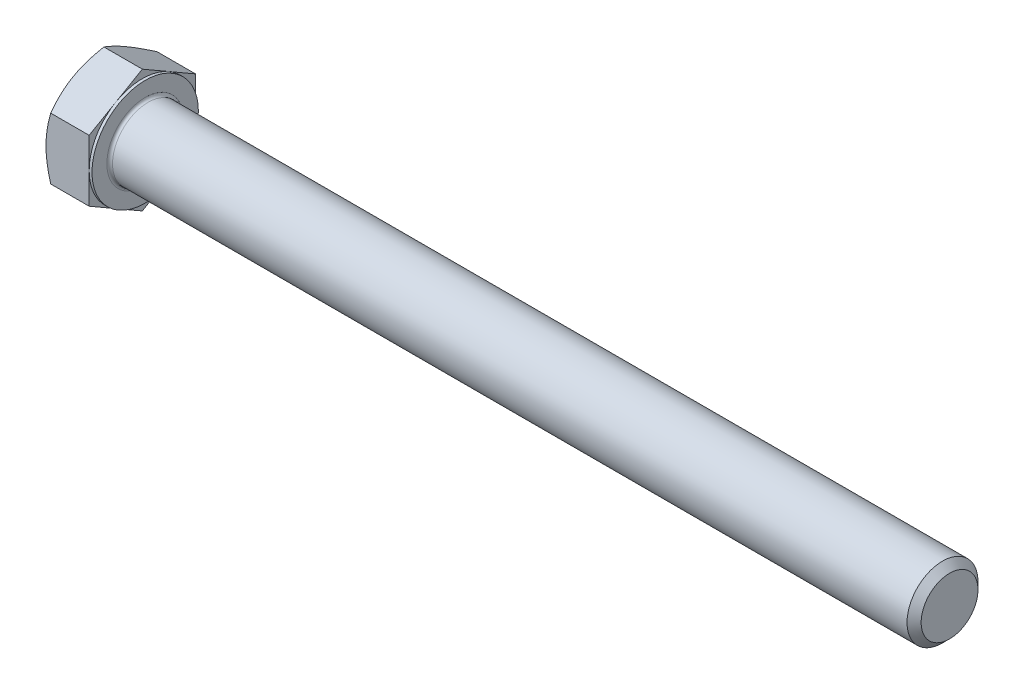
ISO-10303-21;
HEADER;
FILE_DESCRIPTION(('STEP AP214'),'2;1');
FILE_NAME('part.step','',(''),(''),'','','');
FILE_SCHEMA(('AUTOMOTIVE_DESIGN { 1 0 10303 214 1 1 1 1 }'));
ENDSEC;
DATA;
#1=APPLICATION_CONTEXT('core data for automotive mechanical design processes');
#2=APPLICATION_PROTOCOL_DEFINITION('international standard','automotive_design',2000,#1);
#3=PRODUCT_CONTEXT('',#1,'mechanical');
#4=PRODUCT('Part','Part','',(#3));
#5=PRODUCT_RELATED_PRODUCT_CATEGORY('part','',(#4));
#6=PRODUCT_DEFINITION_FORMATION('','',#4);
#7=PRODUCT_DEFINITION_CONTEXT('part definition',#1,'design');
#8=PRODUCT_DEFINITION('design','',#6,#7);
#9=PRODUCT_DEFINITION_SHAPE('','',#8);
#10=(LENGTH_UNIT() NAMED_UNIT(*) SI_UNIT(.MILLI.,.METRE.));
#11=(NAMED_UNIT(*) PLANE_ANGLE_UNIT() SI_UNIT($,.RADIAN.));
#12=(NAMED_UNIT(*) SI_UNIT($,.STERADIAN.) SOLID_ANGLE_UNIT());
#13=UNCERTAINTY_MEASURE_WITH_UNIT(LENGTH_MEASURE(1.E-05),#10,'distance_accuracy_value','');
#14=(GEOMETRIC_REPRESENTATION_CONTEXT(3) GLOBAL_UNCERTAINTY_ASSIGNED_CONTEXT((#13)) GLOBAL_UNIT_ASSIGNED_CONTEXT((#10,
#11,#12)) REPRESENTATION_CONTEXT('',''));
#15=CARTESIAN_POINT('',(0.,0.,0.));
#16=DIRECTION('',(0.,0.,1.));
#17=DIRECTION('',(1.,0.,0.));
#18=AXIS2_PLACEMENT_3D('',#15,#16,#17);
#19=CARTESIAN_POINT('',(6.1722,8.24155962262808,0.));
#20=DIRECTION('',(1.,0.,0.));
#21=DIRECTION('',(0.,0.,-1.));
#22=AXIS2_PLACEMENT_3D('',#19,#20,#21);
#23=PLANE('',#22);
#24=CARTESIAN_POINT('',(6.1722,0.,0.));
#25=DIRECTION('',(1.,0.,0.));
#26=DIRECTION('',(0.,0.,-1.));
#27=AXIS2_PLACEMENT_3D('',#24,#25,#26);
#28=CIRCLE('',#27,5.1435);
#29=CARTESIAN_POINT('',(6.1722,0.,-5.1435));
#30=VERTEX_POINT('',#29);
#31=EDGE_CURVE('E49',#30,#30,#28,.F.);
#32=ORIENTED_EDGE('',*,*,#31,.T.);
#33=EDGE_LOOP('',(#32));
#34=FACE_BOUND('',#33,.T.);
#35=CARTESIAN_POINT('',(6.1722,0.,0.));
#36=DIRECTION('',(1.,0.,0.));
#37=DIRECTION('',(0.,0.,-1.));
#38=AXIS2_PLACEMENT_3D('',#35,#36,#37);
#39=CIRCLE('',#38,7.1374);
#40=CARTESIAN_POINT('',(6.1722,0.,-7.1374));
#41=VERTEX_POINT('',#40);
#42=EDGE_CURVE('E306',#41,#41,#39,.T.);
#43=ORIENTED_EDGE('',*,*,#42,.T.);
#44=EDGE_LOOP('',(#43));
#45=FACE_BOUND('',#44,.T.);
#46=ADVANCED_FACE('F41',(#34,#45),#23,.T.);
#47=CARTESIAN_POINT('',(0.,0.,0.));
#48=DIRECTION('',(-1.,0.,0.));
#49=DIRECTION('',(0.,0.,1.));
#50=AXIS2_PLACEMENT_3D('',#47,#48,#49);
#51=CYLINDRICAL_SURFACE('',#50,4.7625);
#52=CARTESIAN_POINT('',(6.5532,0.,0.));
#53=DIRECTION('',(1.,0.,0.));
#54=DIRECTION('',(0.,0.,-1.));
#55=AXIS2_PLACEMENT_3D('',#52,#53,#54);
#56=CIRCLE('',#55,4.7625);
#57=CARTESIAN_POINT('',(6.5532,0.,-4.7625));
#58=VERTEX_POINT('',#57);
#59=EDGE_CURVE('E11',#58,#58,#56,.T.);
#60=ORIENTED_EDGE('',*,*,#59,.T.);
#61=EDGE_LOOP('',(#60));
#62=FACE_BOUND('',#61,.T.);
#63=CARTESIAN_POINT('',(113.17605,0.,0.));
#64=DIRECTION('',(-1.,0.,0.));
#65=DIRECTION('',(0.,0.,1.));
#66=AXIS2_PLACEMENT_3D('',#63,#64,#65);
#67=CIRCLE('',#66,4.7625);
#68=CARTESIAN_POINT('',(113.17605,0.,4.7625));
#69=VERTEX_POINT('',#68);
#70=EDGE_CURVE('E285',#69,#69,#67,.T.);
#71=ORIENTED_EDGE('',*,*,#70,.T.);
#72=EDGE_LOOP('',(#71));
#73=FACE_BOUND('',#72,.T.);
#74=ADVANCED_FACE('F259',(#62,#73),#51,.T.);
#75=CARTESIAN_POINT('',(114.1222,0.,0.));
#76=DIRECTION('',(-1.,0.,0.));
#77=DIRECTION('',(0.,0.,1.));
#78=AXIS2_PLACEMENT_3D('',#75,#76,#77);
#79=CONICAL_SURFACE('',#78,3.81635,0.785398163397437);
#80=ORIENTED_EDGE('',*,*,#70,.F.);
#81=EDGE_LOOP('',(#80));
#82=FACE_BOUND('',#81,.T.);
#83=CARTESIAN_POINT('',(114.1222,0.,0.));
#84=DIRECTION('',(-1.,0.,0.));
#85=DIRECTION('',(0.,0.,1.));
#86=AXIS2_PLACEMENT_3D('',#83,#84,#85);
#87=CIRCLE('',#86,3.81635);
#88=CARTESIAN_POINT('',(114.1222,0.,3.81635));
#89=VERTEX_POINT('',#88);
#90=EDGE_CURVE('E283',#89,#89,#87,.T.);
#91=ORIENTED_EDGE('',*,*,#90,.T.);
#92=EDGE_LOOP('',(#91));
#93=FACE_BOUND('',#92,.T.);
#94=ADVANCED_FACE('F264',(#82,#93),#79,.T.);
#95=CARTESIAN_POINT('',(114.1222,0.,0.));
#96=DIRECTION('',(-1.,0.,0.));
#97=DIRECTION('',(0.,0.,1.));
#98=AXIS2_PLACEMENT_3D('',#95,#96,#97);
#99=PLANE('',#98);
#100=ORIENTED_EDGE('',*,*,#90,.F.);
#101=EDGE_LOOP('',(#100));
#102=FACE_BOUND('',#101,.T.);
#103=ADVANCED_FACE('F271',(#102),#99,.F.);
#104=CARTESIAN_POINT('',(5.7912,7.1374,0.));
#105=DIRECTION('',(1.,0.,0.));
#106=DIRECTION('',(0.,0.,-1.));
#107=AXIS2_PLACEMENT_3D('',#104,#105,#106);
#108=PLANE('',#107);
#109=DIRECTION('',(0.,0.500000000000001,0.866025403784438));
#110=VECTOR('',#109,1.);
#111=CARTESIAN_POINT('',(5.7912,4.12077981131404,-7.1374));
#112=LINE('',#111,#110);
#113=CARTESIAN_POINT('',(5.7912,4.12077981131404,-7.1374));
#114=VERTEX_POINT('',#113);
#115=CARTESIAN_POINT('',(5.7912,6.18116971697105,-3.56870000000001));
#116=VERTEX_POINT('',#115);
#117=EDGE_CURVE('E173',#114,#116,#112,.T.);
#118=ORIENTED_EDGE('',*,*,#117,.T.);
#119=CARTESIAN_POINT('',(5.7912,0.,0.));
#120=DIRECTION('',(-1.,0.,0.));
#121=DIRECTION('',(0.,0.,1.));
#122=AXIS2_PLACEMENT_3D('',#119,#120,#121);
#123=CIRCLE('',#122,7.1374);
#124=CARTESIAN_POINT('',(5.7912,0.,-7.1374));
#125=VERTEX_POINT('',#124);
#126=EDGE_CURVE('E56',#116,#125,#123,.T.);
#127=ORIENTED_EDGE('',*,*,#126,.T.);
#128=DIRECTION('',(0.,1.,0.));
#129=VECTOR('',#128,1.);
#130=CARTESIAN_POINT('',(5.7912,4.12077981131404,-7.1374));
#131=LINE('',#130,#129);
#132=EDGE_CURVE('E309',#125,#114,#131,.T.);
#133=ORIENTED_EDGE('',*,*,#132,.T.);
#134=EDGE_LOOP('',(#118,#127,#133));
#135=FACE_BOUND('',#134,.T.);
#136=ADVANCED_FACE('F274',(#135),#108,.T.);
#137=CARTESIAN_POINT('',(5.7912,8.24155962262808,0.));
#138=VERTEX_POINT('',#137);
#139=EDGE_CURVE('E171',#116,#138,#112,.T.);
#140=ORIENTED_EDGE('',*,*,#139,.T.);
#141=DIRECTION('',(0.,-0.500000000000001,0.866025403784438));
#142=VECTOR('',#141,1.);
#143=CARTESIAN_POINT('',(5.7912,8.24155962262808,0.));
#144=LINE('',#143,#142);
#145=CARTESIAN_POINT('',(5.7912,6.18116971697105,3.56870000000001));
#146=VERTEX_POINT('',#145);
#147=EDGE_CURVE('E170',#138,#146,#144,.T.);
#148=ORIENTED_EDGE('',*,*,#147,.T.);
#149=EDGE_CURVE('E159',#146,#116,#123,.T.);
#150=ORIENTED_EDGE('',*,*,#149,.T.);
#151=EDGE_LOOP('',(#140,#148,#150));
#152=FACE_BOUND('',#151,.T.);
#153=ADVANCED_FACE('F279',(#152),#108,.T.);
#154=CARTESIAN_POINT('',(5.7912,4.12077981131403,7.1374));
#155=VERTEX_POINT('',#154);
#156=EDGE_CURVE('E138',#146,#155,#144,.T.);
#157=ORIENTED_EDGE('',*,*,#156,.T.);
#158=DIRECTION('',(0.,-1.,0.));
#159=VECTOR('',#158,1.);
#160=CARTESIAN_POINT('',(5.7912,4.12077981131403,7.1374));
#161=LINE('',#160,#159);
#162=CARTESIAN_POINT('',(5.7912,0.,7.1374));
#163=VERTEX_POINT('',#162);
#164=EDGE_CURVE('E132',#155,#163,#161,.T.);
#165=ORIENTED_EDGE('',*,*,#164,.T.);
#166=EDGE_CURVE('E136',#163,#146,#123,.T.);
#167=ORIENTED_EDGE('',*,*,#166,.T.);
#168=EDGE_LOOP('',(#157,#165,#167));
#169=FACE_BOUND('',#168,.T.);
#170=ADVANCED_FACE('F134',(#169),#108,.T.);
#171=CARTESIAN_POINT('',(5.7912,-4.12077981131405,7.1374));
#172=VERTEX_POINT('',#171);
#173=EDGE_CURVE('E142',#163,#172,#161,.T.);
#174=ORIENTED_EDGE('',*,*,#173,.T.);
#175=DIRECTION('',(0.,-0.500000000000001,-0.866025403784438));
#176=VECTOR('',#175,1.);
#177=CARTESIAN_POINT('',(5.7912,-8.2415596226281,0.));
#178=LINE('',#177,#176);
#179=CARTESIAN_POINT('',(5.7912,-6.18116971697105,3.5687));
#180=VERTEX_POINT('',#179);
#181=EDGE_CURVE('E149',#172,#180,#178,.T.);
#182=ORIENTED_EDGE('',*,*,#181,.T.);
#183=EDGE_CURVE('E146',#180,#163,#123,.T.);
#184=ORIENTED_EDGE('',*,*,#183,.T.);
#185=EDGE_LOOP('',(#174,#182,#184));
#186=FACE_BOUND('',#185,.T.);
#187=ADVANCED_FACE('F147',(#186),#108,.T.);
#188=CARTESIAN_POINT('',(5.7912,-8.2415596226281,0.));
#189=VERTEX_POINT('',#188);
#190=EDGE_CURVE('E165',#180,#189,#178,.T.);
#191=ORIENTED_EDGE('',*,*,#190,.T.);
#192=DIRECTION('',(0.,0.500000000000001,-0.866025403784438));
#193=VECTOR('',#192,1.);
#194=CARTESIAN_POINT('',(5.7912,-4.12077981131404,-7.1374));
#195=LINE('',#194,#193);
#196=CARTESIAN_POINT('',(5.7912,-6.18116971697105,-3.56870000000001));
#197=VERTEX_POINT('',#196);
#198=EDGE_CURVE('E347',#189,#197,#195,.T.);
#199=ORIENTED_EDGE('',*,*,#198,.T.);
#200=EDGE_CURVE('E153',#197,#180,#123,.T.);
#201=ORIENTED_EDGE('',*,*,#200,.T.);
#202=EDGE_LOOP('',(#191,#199,#201));
#203=FACE_BOUND('',#202,.T.);
#204=ADVANCED_FACE('F348',(#203),#108,.T.);
#205=CARTESIAN_POINT('',(5.7912,-4.12077981131404,-7.1374));
#206=VERTEX_POINT('',#205);
#207=EDGE_CURVE('E160',#197,#206,#195,.T.);
#208=ORIENTED_EDGE('',*,*,#207,.T.);
#209=EDGE_CURVE('E310',#206,#125,#131,.T.);
#210=ORIENTED_EDGE('',*,*,#209,.T.);
#211=EDGE_CURVE('E317',#125,#197,#123,.T.);
#212=ORIENTED_EDGE('',*,*,#211,.T.);
#213=EDGE_LOOP('',(#208,#210,#212));
#214=FACE_BOUND('',#213,.T.);
#215=ADVANCED_FACE('F280',(#214),#108,.T.);
#216=CARTESIAN_POINT('',(0.,0.,0.));
#217=DIRECTION('',(-1.,0.,0.));
#218=DIRECTION('',(0.,0.,1.));
#219=AXIS2_PLACEMENT_3D('',#216,#217,#218);
#220=CYLINDRICAL_SURFACE('',#219,7.1374);
#221=ORIENTED_EDGE('',*,*,#126,.F.);
#222=ORIENTED_EDGE('',*,*,#149,.F.);
#223=ORIENTED_EDGE('',*,*,#166,.F.);
#224=ORIENTED_EDGE('',*,*,#183,.F.);
#225=ORIENTED_EDGE('',*,*,#200,.F.);
#226=ORIENTED_EDGE('',*,*,#211,.F.);
#227=EDGE_LOOP('',(#221,#222,#223,#224,#225,#226));
#228=FACE_BOUND('',#227,.T.);
#229=ORIENTED_EDGE('',*,*,#42,.F.);
#230=EDGE_LOOP('',(#229));
#231=FACE_BOUND('',#230,.T.);
#232=ADVANCED_FACE('F156',(#228,#231),#220,.T.);
#233=CARTESIAN_POINT('',(0.,8.24155962262808,0.));
#234=DIRECTION('',(1.,0.,0.));
#235=DIRECTION('',(0.,0.,-1.));
#236=AXIS2_PLACEMENT_3D('',#233,#234,#235);
#237=PLANE('',#236);
#238=CARTESIAN_POINT('',(0.,0.,0.));
#239=DIRECTION('',(1.,0.,0.));
#240=DIRECTION('',(0.,0.,-1.));
#241=AXIS2_PLACEMENT_3D('',#238,#239,#240);
#242=CIRCLE('',#241,7.1374);
#243=CARTESIAN_POINT('',(0.,0.,-7.1374));
#244=VERTEX_POINT('',#243);
#245=CARTESIAN_POINT('',(0.,6.18116971697105,-3.56870000000001));
#246=VERTEX_POINT('',#245);
#247=EDGE_CURVE('E305',#244,#246,#242,.T.);
#248=ORIENTED_EDGE('',*,*,#247,.F.);
#249=CARTESIAN_POINT('',(0.,-6.18116971697105,-3.56870000000001));
#250=VERTEX_POINT('',#249);
#251=EDGE_CURVE('E301',#250,#244,#242,.T.);
#252=ORIENTED_EDGE('',*,*,#251,.F.);
#253=CARTESIAN_POINT('',(0.,-6.18116971697105,3.5687));
#254=VERTEX_POINT('',#253);
#255=EDGE_CURVE('E304',#254,#250,#242,.T.);
#256=ORIENTED_EDGE('',*,*,#255,.F.);
#257=CARTESIAN_POINT('',(0.,0.,7.1374));
#258=VERTEX_POINT('',#257);
#259=EDGE_CURVE('E340',#258,#254,#242,.T.);
#260=ORIENTED_EDGE('',*,*,#259,.F.);
#261=CARTESIAN_POINT('',(0.,0.,0.));
#262=DIRECTION('',(-1.,0.,0.));
#263=DIRECTION('',(0.,0.,1.));
#264=AXIS2_PLACEMENT_3D('',#261,#262,#263);
#265=CIRCLE('',#264,7.1374);
#266=CARTESIAN_POINT('',(0.,6.18116971697105,3.56870000000001));
#267=VERTEX_POINT('',#266);
#268=EDGE_CURVE('E174',#258,#267,#265,.T.);
#269=ORIENTED_EDGE('',*,*,#268,.T.);
#270=EDGE_CURVE('E363',#246,#267,#242,.T.);
#271=ORIENTED_EDGE('',*,*,#270,.F.);
#272=EDGE_LOOP('',(#248,#252,#256,#260,#269,#271));
#273=FACE_BOUND('',#272,.T.);
#274=ADVANCED_FACE('F205',(#273),#237,.F.);
#275=CARTESIAN_POINT('',(0.,0.,0.));
#276=DIRECTION('',(1.,0.,0.));
#277=DIRECTION('',(0.,0.,-1.));
#278=AXIS2_PLACEMENT_3D('',#275,#276,#277);
#279=CONICAL_SURFACE('',#278,7.1374,1.0471975511966);
#280=CARTESIAN_POINT('',(0.637553523420339,4.12066434126019,7.1376));
#281=CARTESIAN_POINT('',(0.58526538956535,4.21124371496189,6.98071192263089));
#282=CARTESIAN_POINT('',(0.535350289912878,4.30216081235838,6.82323889066349));
#283=CARTESIAN_POINT('',(0.440919739394803,4.48473335117252,6.50701397737055));
#284=CARTESIAN_POINT('',(0.396406617864097,4.57638909305606,6.34826157562284));
#285=CARTESIAN_POINT('',(0.271843946604595,4.85282383651272,5.86946255497863));
#286=CARTESIAN_POINT('',(0.200994122533559,5.03869401839218,5.54752595635136));
#287=CARTESIAN_POINT('',(0.117914357261565,5.31684536279813,5.06575369564665));
#288=CARTESIAN_POINT('',(0.0942473375753666,5.40829544262839,4.90735751102442));
#289=CARTESIAN_POINT('',(0.0545611977075643,5.59160881473483,4.58984943682929));
#290=CARTESIAN_POINT('',(0.038541401796634,5.68347206977738,4.43073761174693));
#291=CARTESIAN_POINT('',(0.014557978666983,5.86735812462442,4.11223762194846));
#292=CARTESIAN_POINT('',(0.00658520869042971,5.95938062410295,3.95284997741216));
#293=CARTESIAN_POINT('',(-0.00114175893561372,6.14350554574354,3.63393625819102));
#294=CARTESIAN_POINT('',(-0.00089621048245938,6.23560796534863,3.47441018793498));
#295=CARTESIAN_POINT('',(0.0110730517201795,6.48793781485856,3.03736206831758));
#296=CARTESIAN_POINT('',(0.0311658852990948,6.64808264372754,2.75998308814708));
#297=CARTESIAN_POINT('',(0.0948800883359096,6.96730863431005,2.20706745336167));
#298=CARTESIAN_POINT('',(0.138523234308963,7.12638867338148,1.93153274321992));
#299=CARTESIAN_POINT('',(0.247618299095078,7.44625708984547,1.3775043941677));
#300=CARTESIAN_POINT('',(0.313532435992714,7.60700510648809,1.09908066212675));
#301=CARTESIAN_POINT('',(0.463130880450467,7.926103951898,0.546385249240217));
#302=CARTESIAN_POINT('',(0.546780048637376,8.08445886717215,0.272106490357123));
#303=CARTESIAN_POINT('',(0.637553523420346,8.24167509268192,-0.000200000000000164));
#304=B_SPLINE_CURVE_WITH_KNOTS('',3,(#280,#281,#282,#283,#284,#285,#286,#287,#288,#289,#290,
#291,#292,#293,#294,#295,#296,#297,#298,#299,#300,#301,#302,#303),.UNSPECIFIED.,.F.,.F.,(4,2,2,
2,2,2,2,2,2,2,2,4),(0.,0.565616271543686,1.13147557690344,2.26554547664276,2.81869146049268,
3.37178855781927,3.92425653519419,4.4767074445971,5.4384561482934,6.40109569003607,
7.3850851165131,8.36714283329691),.UNSPECIFIED.);
#305=CARTESIAN_POINT('',(0.637486855352628,8.24155962262808,0.));
#306=VERTEX_POINT('',#305);
#307=EDGE_CURVE('E225',#267,#306,#304,.T.);
#308=ORIENTED_EDGE('',*,*,#307,.T.);
#309=CARTESIAN_POINT('',(0.637553523420345,8.24167509268192,0.000200000000000209));
#310=CARTESIAN_POINT('',(0.585265389565357,8.15109571898022,-0.15668807736911));
#311=CARTESIAN_POINT('',(0.535350289912885,8.06017862158373,-0.314161109336511));
#312=CARTESIAN_POINT('',(0.44091973939481,7.87760608276959,-0.63038602262945));
#313=CARTESIAN_POINT('',(0.396406617864103,7.78595034088605,-0.789138424377165));
#314=CARTESIAN_POINT('',(0.2718439466046,7.50951559742939,-1.26793744502137));
#315=CARTESIAN_POINT('',(0.200994122533562,7.32364541554993,-1.58987404364865));
#316=CARTESIAN_POINT('',(0.117914357261569,7.04549407114397,-2.07164630435335));
#317=CARTESIAN_POINT('',(0.0942473375753701,6.95404399131372,-2.23004248897558));
#318=CARTESIAN_POINT('',(0.0545611977075678,6.77073061920728,-2.54755056317072));
#319=CARTESIAN_POINT('',(0.0385414017966372,6.67886736416473,-2.70666238825308));
#320=CARTESIAN_POINT('',(0.0145579786669858,6.49498130931769,-3.02516237805154));
#321=CARTESIAN_POINT('',(0.00658520869043239,6.40295880983916,-3.18455002258784));
#322=CARTESIAN_POINT('',(-0.00114175893561164,6.21883388819857,-3.50346374180898));
#323=CARTESIAN_POINT('',(-0.000896210482457776,6.12673146859347,-3.66298981206503));
#324=CARTESIAN_POINT('',(0.0110730517201801,5.87440161908355,-4.10003793168242));
#325=CARTESIAN_POINT('',(0.031165885299095,5.71425679021457,-4.37741691185292));
#326=CARTESIAN_POINT('',(0.0948800883359092,5.39503079963206,-4.93033254663833));
#327=CARTESIAN_POINT('',(0.138523234308962,5.23595076056063,-5.20586725678008));
#328=CARTESIAN_POINT('',(0.247618299095076,4.91608234409665,-5.75989560583231));
#329=CARTESIAN_POINT('',(0.313532435992711,4.75533432745403,-6.03831933787326));
#330=CARTESIAN_POINT('',(0.463130880450462,4.43623548204412,-6.59101475075978));
#331=CARTESIAN_POINT('',(0.54678004863737,4.27788056676997,-6.86529350964288));
#332=CARTESIAN_POINT('',(0.63755352342034,4.1206643412602,-7.1376));
#333=B_SPLINE_CURVE_WITH_KNOTS('',3,(#309,#310,#311,#312,#313,#314,#315,#316,#317,#318,#319,
#320,#321,#322,#323,#324,#325,#326,#327,#328,#329,#330,#331,#332),.UNSPECIFIED.,.F.,.F.,(4,2,2,
2,2,2,2,2,2,2,2,4),(0.,0.565616271543686,1.13147557690344,2.26554547664276,2.81869146049269,
3.37178855781927,3.9242565351942,4.4767074445971,5.43845614829341,6.40109569003607,
7.3850851165131,8.36714283329691),.UNSPECIFIED.);
#334=EDGE_CURVE('E64',#306,#246,#333,.T.);
#335=ORIENTED_EDGE('',*,*,#334,.T.);
#336=ORIENTED_EDGE('',*,*,#270,.T.);
#337=EDGE_LOOP('',(#308,#335,#336));
#338=FACE_BOUND('',#337,.T.);
#339=ADVANCED_FACE('F364',(#338),#279,.T.);
#340=CARTESIAN_POINT('',(3.51793891464085,-11.1403587268438,7.1374));
#341=CARTESIAN_POINT('',(3.3661176136154,-10.8279722926894,7.1374));
#342=CARTESIAN_POINT('',(3.21573167435815,-10.5148763007017,7.1374));
#343=CARTESIAN_POINT('',(2.91863653133451,-9.88688803265222,7.1374));
#344=CARTESIAN_POINT('',(2.77192789362363,-9.57199548909057,7.1374));
#345=CARTESIAN_POINT('',(2.4822707439764,-8.93844907707205,7.1374));
#346=CARTESIAN_POINT('',(2.33934643030354,-8.61978410734443,7.1374));
#347=CARTESIAN_POINT('',(2.05925336317274,-7.97994405772781,7.1374));
#348=CARTESIAN_POINT('',(1.92208434228597,-7.65876909529411,7.1374));
#349=CARTESIAN_POINT('',(1.65065378230837,-7.00284865103087,7.1374));
#350=CARTESIAN_POINT('',(1.51663374065787,-6.66800268560586,7.1374));
#351=CARTESIAN_POINT('',(1.25856485288051,-5.99442084818067,7.1374));
#352=CARTESIAN_POINT('',(1.13451711533335,-5.65568454847852,7.1374));
#353=CARTESIAN_POINT('',(0.899596727677593,-4.97438980758157,7.1374));
#354=CARTESIAN_POINT('',(0.788698036742921,-4.6318404419915,7.1374));
#355=CARTESIAN_POINT('',(0.583585288609217,-3.94184101121263,7.1374));
#356=CARTESIAN_POINT('',(0.489366053461918,-3.59439250319722,7.1374));
#357=CARTESIAN_POINT('',(0.322585119775292,-2.8962364341233,7.1374));
#358=CARTESIAN_POINT('',(0.249906108267925,-2.5455576685563,7.1374));
#359=CARTESIAN_POINT('',(0.160162927876229,-2.01629019056177,7.1374));
#360=CARTESIAN_POINT('',(0.133459926561138,-1.8393139589974,7.1374));
#361=CARTESIAN_POINT('',(0.0870009608751889,-1.48445773938037,7.1374));
#362=CARTESIAN_POINT('',(0.0672443235865599,-1.30657784056352,7.1374));
#363=CARTESIAN_POINT('',(0.0353233928817926,-0.952509042934691,7.1374));
#364=CARTESIAN_POINT('',(0.0230620606560385,-0.776328928434261,7.1374));
#365=CARTESIAN_POINT('',(0.00600431660240971,-0.42360784078969,7.1374));
#366=CARTESIAN_POINT('',(0.00120777872271334,-0.247066873789374,7.1374));
#367=CARTESIAN_POINT('',(-0.000805707966080239,0.106061109313523,7.1374));
#368=CARTESIAN_POINT('',(0.00197740745485942,0.282648125793647,7.1374));
#369=CARTESIAN_POINT('',(0.0150543642253246,0.635545980126688,7.1374));
#370=CARTESIAN_POINT('',(0.0253485677088149,0.81185680425272,7.1374));
#371=CARTESIAN_POINT('',(0.058717354667661,1.23335791869124,7.1374));
#372=CARTESIAN_POINT('',(0.0852317102922975,1.47828183508493,7.1374));
#373=CARTESIAN_POINT('',(0.151325348901077,1.96634766484073,7.1374));
#374=CARTESIAN_POINT('',(0.190906342916655,2.20948934055999,7.1374));
#375=CARTESIAN_POINT('',(0.327153349211705,2.93593608611635,7.1374));
#376=CARTESIAN_POINT('',(0.44130049501773,3.41600789467397,7.1374));
#377=CARTESIAN_POINT('',(0.639740105584511,4.13409780337112,7.1374));
#378=CARTESIAN_POINT('',(0.711386839279739,4.37582477933244,7.1374));
#379=CARTESIAN_POINT('',(0.862240726867137,4.8569312345941,7.1374));
#380=CARTESIAN_POINT('',(0.941447936163005,5.09631069667751,7.1374));
#381=CARTESIAN_POINT('',(1.10614180608764,5.57279746249286,7.1374));
#382=CARTESIAN_POINT('',(1.19162653724197,5.80990543927402,7.1374));
#383=CARTESIAN_POINT('',(1.36785754588297,6.2821465109029,7.1374));
#384=CARTESIAN_POINT('',(1.4586037216663,6.51727964382368,7.1374));
#385=CARTESIAN_POINT('',(1.70099135878086,7.12822933634875,7.1374));
#386=CARTESIAN_POINT('',(1.85611245200932,7.50266378649051,7.1374));
#387=CARTESIAN_POINT('',(2.17492034788947,8.24788094227115,7.1374));
#388=CARTESIAN_POINT('',(2.338607954525,8.61866330126001,7.1374));
#389=CARTESIAN_POINT('',(2.67260301704526,9.35737269718078,7.1374));
#390=CARTESIAN_POINT('',(2.84291264405929,9.72529874938112,7.1374));
#391=CARTESIAN_POINT('',(3.18863367809307,10.4587232704182,7.1374));
#392=CARTESIAN_POINT('',(3.36404491157501,10.8242218213112,7.1374));
#393=CARTESIAN_POINT('',(3.71915496627049,11.553777334436,7.1374));
#394=CARTESIAN_POINT('',(3.89885959822866,11.9178314626509,7.1374));
#395=CARTESIAN_POINT('',(4.26150568432076,12.6443245246618,7.1374));
#396=CARTESIAN_POINT('',(4.44444716083242,13.0067634472695,7.1374));
#397=CARTESIAN_POINT('',(4.81291716764715,13.7302353242129,7.1374));
#398=CARTESIAN_POINT('',(4.99844519827983,14.0912685333269,7.1374));
#399=CARTESIAN_POINT('',(5.37165471040536,14.8122208146436,7.1374));
#400=CARTESIAN_POINT('',(5.5593362003751,15.1721398824537,7.1374));
#401=CARTESIAN_POINT('',(6.08751400276288,16.178957952041,7.1374));
#402=CARTESIAN_POINT('',(6.43000254365912,16.8248116492746,7.1374));
#403=CARTESIAN_POINT('',(7.11919785487995,18.1143032770824,7.1374));
#404=CARTESIAN_POINT('',(7.46590484738284,18.7579410886394,7.1374));
#405=CARTESIAN_POINT('',(8.16140637459828,20.0415314633599,7.1374));
#406=CARTESIAN_POINT('',(8.51019123426671,20.6814892741017,7.1374));
#407=CARTESIAN_POINT('',(9.21019417047442,21.9600146152105,7.1374));
#408=CARTESIAN_POINT('',(9.56141207357467,22.5985822404971,7.1374));
#409=CARTESIAN_POINT('',(9.91351913441366,23.2366555668877,7.1374));
#410=B_SPLINE_CURVE_WITH_KNOTS('',3,(#340,#341,#342,#343,#344,#345,#346,#347,#348,#349,#350,
#351,#352,#353,#354,#355,#356,#357,#358,#359,#360,#361,#362,#363,#364,#365,#366,#367,#368,#369,
#370,#371,#372,#373,#374,#375,#376,#377,#378,#379,#380,#381,#382,#383,#384,#385,#386,#387,#388,
#389,#390,#391,#392,#393,#394,#395,#396,#397,#398,#399,#400,#401,#402,#403,#404,#405,#406,#407,
#408,#409),.UNSPECIFIED.,.F.,.F.,(4,2,2,2,2,2,2,2,2,2,2,2,2,2,2,2,2,2,2,2,2,2,2,2,2,2,2,2,2,2,2,
2,2,2,4),(0.,1.0419888362068,2.08413709519682,3.13183784368231,4.17948985504911,
5.26137797247103,6.34338619307611,7.42321444996099,8.50270689628368,9.57620733057732,
10.113030795566,10.6498022423129,11.179468394122,11.7091256017988,12.2387872978086,
12.7684745322176,13.507123574382,14.245869378494,15.7241255438818,16.4804246089875,
17.2367292167316,17.9928023300467,18.7488608333938,19.9645892594812,21.1804319893616,
22.3966767697583,23.6128802262777,24.8308351286453,26.0487984545625,27.2665296678531,
28.4842656762732,30.6773737382256,32.8705978115956,35.0570894097065,37.2434267159856),.UNSPECIFIED.);
#411=CARTESIAN_POINT('',(0.637486855352622,4.12077981131403,7.1374));
#412=VERTEX_POINT('',#411);
#413=EDGE_CURVE('E239',#258,#412,#410,.T.);
#414=ORIENTED_EDGE('',*,*,#413,.T.);
#415=EDGE_CURVE('E238',#412,#267,#304,.T.);
#416=ORIENTED_EDGE('',*,*,#415,.T.);
#417=ORIENTED_EDGE('',*,*,#268,.F.);
#418=EDGE_LOOP('',(#414,#416,#417));
#419=FACE_BOUND('',#418,.T.);
#420=ADVANCED_FACE('F334',(#419),#279,.T.);
#421=CARTESIAN_POINT('',(0.637486855352629,-4.12077981131405,7.1374));
#422=VERTEX_POINT('',#421);
#423=EDGE_CURVE('E286',#422,#258,#410,.T.);
#424=ORIENTED_EDGE('',*,*,#423,.T.);
#425=ORIENTED_EDGE('',*,*,#259,.T.);
#426=CARTESIAN_POINT('',(0.637553523420355,-8.24167509268193,-0.000200000000000293));
#427=CARTESIAN_POINT('',(0.585265389565366,-8.15109571898024,0.15668807736911));
#428=CARTESIAN_POINT('',(0.535350289912893,-8.06017862158375,0.314161109336512));
#429=CARTESIAN_POINT('',(0.440919739394818,-7.8776060827696,0.630386022629452));
#430=CARTESIAN_POINT('',(0.396406617864111,-7.78595034088606,0.789138424377167));
#431=CARTESIAN_POINT('',(0.271843946604609,-7.5095155974294,1.26793744502137));
#432=CARTESIAN_POINT('',(0.200994122533572,-7.32364541554995,1.58987404364865));
#433=CARTESIAN_POINT('',(0.117914357261578,-7.04549407114399,2.07164630435336));
#434=CARTESIAN_POINT('',(0.0942473375753785,-6.95404399131374,2.23004248897559));
#435=CARTESIAN_POINT('',(0.0545611977075756,-6.77073061920729,2.54755056317072));
#436=CARTESIAN_POINT('',(0.0385414017966451,-6.67886736416474,2.70666238825308));
#437=CARTESIAN_POINT('',(0.0145579786669937,-6.4949813093177,3.02516237805155));
#438=CARTESIAN_POINT('',(0.00658520869044016,-6.40295880983917,3.18455002258785));
#439=CARTESIAN_POINT('',(-0.00114175893560389,-6.21883388819858,3.50346374180899));
#440=CARTESIAN_POINT('',(-0.000896210482449921,-6.12673146859349,3.66298981206504));
#441=CARTESIAN_POINT('',(0.0110730517201883,-5.87440161908356,4.10003793168243));
#442=CARTESIAN_POINT('',(0.0311658852991035,-5.71425679021458,4.37741691185293));
#443=CARTESIAN_POINT('',(0.0948800883359176,-5.39503079963207,4.93033254663834));
#444=CARTESIAN_POINT('',(0.13852323430897,-5.23595076056065,5.20586725678009));
#445=CARTESIAN_POINT('',(0.247618299095084,-4.91608234409666,5.75989560583231));
#446=CARTESIAN_POINT('',(0.313532435992718,-4.75533432745404,6.03831933787326));
#447=CARTESIAN_POINT('',(0.463130880450469,-4.43623548204413,6.59101475075979));
#448=CARTESIAN_POINT('',(0.546780048637376,-4.27788056676998,6.86529350964288));
#449=CARTESIAN_POINT('',(0.637553523420346,-4.12066434126022,7.1376));
#450=B_SPLINE_CURVE_WITH_KNOTS('',3,(#426,#427,#428,#429,#430,#431,#432,#433,#434,#435,#436,
#437,#438,#439,#440,#441,#442,#443,#444,#445,#446,#447,#448,#449),.UNSPECIFIED.,.F.,.F.,(4,2,2,
2,2,2,2,2,2,2,2,4),(0.,0.565616271543688,1.13147557690344,2.26554547664277,2.81869146049269,
3.37178855781928,3.9242565351942,4.47670744459711,5.43845614829341,6.40109569003608,
7.3850851165131,8.36714283329691),.UNSPECIFIED.);
#451=EDGE_CURVE('E227',#254,#422,#450,.T.);
#452=ORIENTED_EDGE('',*,*,#451,.T.);
#453=EDGE_LOOP('',(#424,#425,#452));
#454=FACE_BOUND('',#453,.T.);
#455=ADVANCED_FACE('F194',(#454),#279,.T.);
#456=CARTESIAN_POINT('',(0.637486855352637,-8.2415596226281,0.));
#457=VERTEX_POINT('',#456);
#458=EDGE_CURVE('E219',#457,#254,#450,.T.);
#459=ORIENTED_EDGE('',*,*,#458,.T.);
#460=ORIENTED_EDGE('',*,*,#255,.T.);
#461=CARTESIAN_POINT('',(0.637553523420343,-4.12066434126021,-7.1376));
#462=CARTESIAN_POINT('',(0.585265389565354,-4.2112437149619,-6.98071192263089));
#463=CARTESIAN_POINT('',(0.535350289912882,-4.30216081235839,-6.82323889066349));
#464=CARTESIAN_POINT('',(0.440919739394808,-4.48473335117254,-6.50701397737055));
#465=CARTESIAN_POINT('',(0.396406617864102,-4.57638909305608,-6.34826157562284));
#466=CARTESIAN_POINT('',(0.2718439466046,-4.85282383651274,-5.86946255497863));
#467=CARTESIAN_POINT('',(0.200994122533564,-5.03869401839219,-5.54752595635135));
#468=CARTESIAN_POINT('',(0.117914357261571,-5.31684536279815,-5.06575369564665));
#469=CARTESIAN_POINT('',(0.094247337575373,-5.4082954426284,-4.90735751102442));
#470=CARTESIAN_POINT('',(0.0545611977075713,-5.59160881473484,-4.58984943682929));
#471=CARTESIAN_POINT('',(0.0385414017966411,-5.6834720697774,-4.43073761174693));
#472=CARTESIAN_POINT('',(0.01455797866699,-5.86735812462444,-4.11223762194846));
#473=CARTESIAN_POINT('',(0.00658520869043655,-5.95938062410297,-3.95284997741216));
#474=CARTESIAN_POINT('',(-0.00114175893560653,-6.14350554574356,-3.63393625819102));
#475=CARTESIAN_POINT('',(-0.000896210482451733,-6.23560796534865,-3.47441018793497));
#476=CARTESIAN_POINT('',(0.0110730517201878,-6.48793781485857,-3.03736206831758));
#477=CARTESIAN_POINT('',(0.0311658852991028,-6.64808264372756,-2.75998308814708));
#478=CARTESIAN_POINT('',(0.0948800883359181,-6.96730863431007,-2.20706745336167));
#479=CARTESIAN_POINT('',(0.138523234308972,-7.12638867338149,-1.93153274321992));
#480=CARTESIAN_POINT('',(0.247618299095088,-7.44625708984548,-1.37750439416769));
#481=CARTESIAN_POINT('',(0.313532435992723,-7.6070051064881,-1.09908066212675));
#482=CARTESIAN_POINT('',(0.463130880450476,-7.92610395189802,-0.546385249240216));
#483=CARTESIAN_POINT('',(0.546780048637384,-8.08445886717217,-0.272106490357122));
#484=CARTESIAN_POINT('',(0.637553523420355,-8.24167509268193,0.000199999999999872));
#485=B_SPLINE_CURVE_WITH_KNOTS('',3,(#461,#462,#463,#464,#465,#466,#467,#468,#469,#470,#471,
#472,#473,#474,#475,#476,#477,#478,#479,#480,#481,#482,#483,#484),.UNSPECIFIED.,.F.,.F.,(4,2,2,
2,2,2,2,2,2,2,2,4),(0.,0.565616271543686,1.13147557690344,2.26554547664276,2.81869146049268,
3.37178855781927,3.92425653519419,4.4767074445971,5.4384561482934,6.40109569003608,
7.3850851165131,8.36714283329691),.UNSPECIFIED.);
#486=EDGE_CURVE('E226',#250,#457,#485,.T.);
#487=ORIENTED_EDGE('',*,*,#486,.T.);
#488=EDGE_LOOP('',(#459,#460,#487));
#489=FACE_BOUND('',#488,.T.);
#490=ADVANCED_FACE('F362',(#489),#279,.T.);
#491=CARTESIAN_POINT('',(0.637486855352623,4.12077981131404,-7.1374));
#492=VERTEX_POINT('',#491);
#493=EDGE_CURVE('E228',#246,#492,#333,.T.);
#494=ORIENTED_EDGE('',*,*,#493,.T.);
#495=CARTESIAN_POINT('',(3.51793891529157,-11.1403587281823,-7.1374));
#496=CARTESIAN_POINT('',(3.36611761423893,-10.8279722939829,-7.1374));
#497=CARTESIAN_POINT('',(3.21573167495451,-10.5148763019502,-7.1374));
#498=CARTESIAN_POINT('',(2.91863653187664,-9.88688803381042,-7.1374));
#499=CARTESIAN_POINT('',(2.77192789413872,-9.57199549020357,-7.1374));
#500=CARTESIAN_POINT('',(2.48227074443738,-8.93844907809396,-7.1374));
#501=CARTESIAN_POINT('',(2.33934643073746,-8.61978410832044,-7.1374));
#502=CARTESIAN_POINT('',(2.059253363553,-7.9799440586117,-7.1374));
#503=CARTESIAN_POINT('',(1.92208434263961,-7.65876909613178,-7.1374));
#504=CARTESIAN_POINT('',(1.65065378260809,-7.00284865177263,-7.1374));
#505=CARTESIAN_POINT('',(1.51663374093033,-6.66800268629789,-7.1374));
#506=CARTESIAN_POINT('',(1.25856485309991,-5.99442084877243,-7.1374));
#507=CARTESIAN_POINT('',(1.13451711552695,-5.65568454901975,-7.1374));
#508=CARTESIAN_POINT('',(0.89959672782208,-4.97438980802079,-7.1374));
#509=CARTESIAN_POINT('',(0.788698036864086,-4.63184044237925,-7.1374));
#510=CARTESIAN_POINT('',(0.583585288687564,-3.94184101149603,-7.1374));
#511=CARTESIAN_POINT('',(0.489366053520766,-3.59439250342776,-7.1374));
#512=CARTESIAN_POINT('',(0.322585119794828,-2.89623643422076,-7.1374));
#513=CARTESIAN_POINT('',(0.249906108269177,-2.54555766857317,-7.1374));
#514=CARTESIAN_POINT('',(0.160162927859161,-2.01629019045636,-7.1374));
#515=CARTESIAN_POINT('',(0.133459926539483,-1.83931395885101,-7.1374));
#516=CARTESIAN_POINT('',(0.0870009608477335,-1.48445773915167,-7.1374));
#517=CARTESIAN_POINT('',(0.0672443235578903,-1.3065778402935,-7.1374));
#518=CARTESIAN_POINT('',(0.0353233928543438,-0.952509042582881,-7.1374));
#519=CARTESIAN_POINT('',(0.0230620606309586,-0.776328928041985,-7.1374));
#520=CARTESIAN_POINT('',(0.00600431658563618,-0.423607840316564,-7.1374));
#521=CARTESIAN_POINT('',(0.00120777871187734,-0.247066873275866,-7.1374));
#522=CARTESIAN_POINT('',(-0.000805707961560346,0.106061109907489,-7.1374));
#523=CARTESIAN_POINT('',(0.00197740746879839,0.28264812642769,-7.1374));
#524=CARTESIAN_POINT('',(0.0150543642613316,0.635545980840357,-7.1374));
#525=CARTESIAN_POINT('',(0.0253485677574711,0.811856805005941,-7.1374));
#526=CARTESIAN_POINT('',(0.0587173547474296,1.2333579195058,-7.1374));
#527=CARTESIAN_POINT('',(0.0852317103899929,1.4782818359211,-7.1374));
#528=CARTESIAN_POINT('',(0.151325349035589,1.96634766571914,-7.1374));
#529=CARTESIAN_POINT('',(0.190906343070057,2.20948934145905,-7.1374));
#530=CARTESIAN_POINT('',(0.327153349422179,2.93593608707621,-7.1374));
#531=CARTESIAN_POINT('',(0.441300495266764,3.4160078956728,-7.1374));
#532=CARTESIAN_POINT('',(0.639740105890462,4.13409780442825,-7.1374));
#533=CARTESIAN_POINT('',(0.711386839604794,4.37582478040941,-7.1374));
#534=CARTESIAN_POINT('',(0.862240727229828,4.85693123571053,-7.1374));
#535=CARTESIAN_POINT('',(0.941447936544229,5.09631069781357,-7.1374));
#536=CARTESIAN_POINT('',(1.10614180650527,5.57279746366803,-7.1374));
#537=CARTESIAN_POINT('',(1.19162653767748,5.80990544046867,-7.1374));
#538=CARTESIAN_POINT('',(1.36785754635362,6.28214651213652,-7.1374));
#539=CARTESIAN_POINT('',(1.45860372215423,6.51727964507679,-7.1374));
#540=CARTESIAN_POINT('',(1.70099135929759,7.12822933761366,-7.1374));
#541=CARTESIAN_POINT('',(1.85611245253596,7.50266378774826,-7.1374));
#542=CARTESIAN_POINT('',(2.1749203484332,8.24788094351546,-7.1374));
#543=CARTESIAN_POINT('',(2.3386079550759,8.61866330249805,-7.1374));
#544=CARTESIAN_POINT('',(2.6726030176085,9.35737269840695,-7.1374));
#545=CARTESIAN_POINT('',(2.8429126446277,9.72529875060169,-7.1374));
#546=CARTESIAN_POINT('',(3.18863367867035,10.4587232716281,-7.1374));
#547=CARTESIAN_POINT('',(3.364044912156,10.8242218225161,-7.1374));
#548=CARTESIAN_POINT('',(3.71915496685771,11.5537773356311,-7.1374));
#549=CARTESIAN_POINT('',(3.89885959881839,11.9178314638412,-7.1374));
#550=CARTESIAN_POINT('',(4.26150568491469,12.6443245258428,-7.1374));
#551=CARTESIAN_POINT('',(4.44444716142804,13.006763448446,-7.1374));
#552=CARTESIAN_POINT('',(4.81291716824556,13.7302353253808,-7.1374));
#553=CARTESIAN_POINT('',(4.99844519887934,14.0912685344906,-7.1374));
#554=CARTESIAN_POINT('',(5.37165471100658,14.8122208157994,-7.1374));
#555=CARTESIAN_POINT('',(5.55933620097694,15.1721398836055,-7.1374));
#556=CARTESIAN_POINT('',(6.08751400336931,16.1789579531886,-7.1374));
#557=CARTESIAN_POINT('',(6.43000254426915,16.824811650422,-7.1374));
#558=CARTESIAN_POINT('',(7.11919785549645,18.1143032782299,-7.1374));
#559=CARTESIAN_POINT('',(7.46590484800222,18.757941089787,-7.1374));
#560=CARTESIAN_POINT('',(8.16140637522346,20.0415314645091,-7.1374));
#561=CARTESIAN_POINT('',(8.51019123489483,20.6814892752525,-7.1374));
#562=CARTESIAN_POINT('',(9.21019417110809,21.9600146163644,-7.1374));
#563=CARTESIAN_POINT('',(9.56141207421095,22.5985822416527,-7.1374));
#564=CARTESIAN_POINT('',(9.91351913505243,23.2366555680451,-7.1374));
#565=B_SPLINE_CURVE_WITH_KNOTS('',3,(#495,#496,#497,#498,#499,#500,#501,#502,#503,#504,#505,
#506,#507,#508,#509,#510,#511,#512,#513,#514,#515,#516,#517,#518,#519,#520,#521,#522,#523,#524,
#525,#526,#527,#528,#529,#530,#531,#532,#533,#534,#535,#536,#537,#538,#539,#540,#541,#542,#543,
#544,#545,#546,#547,#548,#549,#550,#551,#552,#553,#554,#555,#556,#557,#558,#559,#560,#561,#562,
#563,#564),.UNSPECIFIED.,.F.,.F.,(4,2,2,2,2,2,2,2,2,2,2,2,2,2,2,2,2,2,2,2,2,2,2,2,2,2,2,2,2,2,2,
2,2,2,4),(0.,1.04198883636395,2.08413709551114,3.1318378441555,4.17948985568116,
5.26137797327195,6.34338619404597,7.42321445109922,8.50270689759014,9.57620733213103,
10.1130307972433,10.6498022441137,11.1794683960432,11.7091256038406,12.2387872999709,
12.7684745345005,13.507123576735,14.2458693809173,15.7241255464457,16.4804246116249,
17.2367292194424,17.9928023328306,18.748860836251,19.96458926233,21.1804319922019,
22.3966767725898,23.6128802291006,24.8308351314585,26.048798457366,27.2665296706471,
28.4842656790577,30.6773737410147,32.8705978143893,35.0570894125083,37.2434267187957),.UNSPECIFIED.);
#566=EDGE_CURVE('E186',#492,#244,#565,.F.);
#567=ORIENTED_EDGE('',*,*,#566,.T.);
#568=ORIENTED_EDGE('',*,*,#247,.T.);
#569=EDGE_LOOP('',(#494,#567,#568));
#570=FACE_BOUND('',#569,.T.);
#571=ADVANCED_FACE('F359',(#570),#279,.T.);
#572=CARTESIAN_POINT('',(0.637486855352626,-4.12077981131404,-7.1374));
#573=VERTEX_POINT('',#572);
#574=EDGE_CURVE('E187',#573,#250,#485,.T.);
#575=ORIENTED_EDGE('',*,*,#574,.T.);
#576=ORIENTED_EDGE('',*,*,#251,.T.);
#577=EDGE_CURVE('E177',#244,#573,#565,.F.);
#578=ORIENTED_EDGE('',*,*,#577,.T.);
#579=EDGE_LOOP('',(#575,#576,#578));
#580=FACE_BOUND('',#579,.T.);
#581=ADVANCED_FACE('F203',(#580),#279,.T.);
#582=CARTESIAN_POINT('',(6.1722,4.12077981131404,-7.1374));
#583=DIRECTION('',(0.,0.,1.));
#584=DIRECTION('',(0.,-1.,0.));
#585=AXIS2_PLACEMENT_3D('',#582,#583,#584);
#586=PLANE('',#585);
#587=ORIENTED_EDGE('',*,*,#209,.F.);
#588=DIRECTION('',(-1.,0.,0.));
#589=VECTOR('',#588,1.);
#590=CARTESIAN_POINT('',(6.1722,-4.12077981131404,-7.1374));
#591=LINE('',#590,#589);
#592=EDGE_CURVE('E292',#206,#573,#591,.T.);
#593=ORIENTED_EDGE('',*,*,#592,.T.);
#594=ORIENTED_EDGE('',*,*,#577,.F.);
#595=ORIENTED_EDGE('',*,*,#566,.F.);
#596=DIRECTION('',(-1.,0.,0.));
#597=VECTOR('',#596,1.);
#598=CARTESIAN_POINT('',(6.1722,4.12077981131404,-7.1374));
#599=LINE('',#598,#597);
#600=EDGE_CURVE('E288',#114,#492,#599,.T.);
#601=ORIENTED_EDGE('',*,*,#600,.F.);
#602=ORIENTED_EDGE('',*,*,#132,.F.);
#603=EDGE_LOOP('',(#587,#593,#594,#595,#601,#602));
#604=FACE_BOUND('',#603,.T.);
#605=ADVANCED_FACE('F198',(#604),#586,.F.);
#606=CARTESIAN_POINT('',(6.1722,-4.12077981131404,-7.1374));
#607=DIRECTION('',(0.,0.866025403784438,0.500000000000001));
#608=DIRECTION('',(0.,-0.500000000000001,0.866025403784438));
#609=AXIS2_PLACEMENT_3D('',#606,#607,#608);
#610=PLANE('',#609);
#611=ORIENTED_EDGE('',*,*,#198,.F.);
#612=DIRECTION('',(-1.,0.,0.));
#613=VECTOR('',#612,1.);
#614=CARTESIAN_POINT('',(6.1722,-8.2415596226281,0.));
#615=LINE('',#614,#613);
#616=EDGE_CURVE('E294',#189,#457,#615,.T.);
#617=ORIENTED_EDGE('',*,*,#616,.T.);
#618=ORIENTED_EDGE('',*,*,#486,.F.);
#619=ORIENTED_EDGE('',*,*,#574,.F.);
#620=ORIENTED_EDGE('',*,*,#592,.F.);
#621=ORIENTED_EDGE('',*,*,#207,.F.);
#622=EDGE_LOOP('',(#611,#617,#618,#619,#620,#621));
#623=FACE_BOUND('',#622,.T.);
#624=ADVANCED_FACE('F202',(#623),#610,.F.);
#625=CARTESIAN_POINT('',(6.1722,-8.2415596226281,0.));
#626=DIRECTION('',(0.,0.866025403784438,-0.500000000000001));
#627=DIRECTION('',(0.,0.500000000000001,0.866025403784438));
#628=AXIS2_PLACEMENT_3D('',#625,#626,#627);
#629=PLANE('',#628);
#630=ORIENTED_EDGE('',*,*,#181,.F.);
#631=DIRECTION('',(-1.,0.,0.));
#632=VECTOR('',#631,1.);
#633=CARTESIAN_POINT('',(6.1722,-4.12077981131405,7.1374));
#634=LINE('',#633,#632);
#635=EDGE_CURVE('E164',#172,#422,#634,.T.);
#636=ORIENTED_EDGE('',*,*,#635,.T.);
#637=ORIENTED_EDGE('',*,*,#451,.F.);
#638=ORIENTED_EDGE('',*,*,#458,.F.);
#639=ORIENTED_EDGE('',*,*,#616,.F.);
#640=ORIENTED_EDGE('',*,*,#190,.F.);
#641=EDGE_LOOP('',(#630,#636,#637,#638,#639,#640));
#642=FACE_BOUND('',#641,.T.);
#643=ADVANCED_FACE('F210',(#642),#629,.F.);
#644=CARTESIAN_POINT('',(6.1722,4.12077981131403,7.1374));
#645=DIRECTION('',(0.,0.,-1.));
#646=DIRECTION('',(-1.,0.,0.));
#647=AXIS2_PLACEMENT_3D('',#644,#645,#646);
#648=PLANE('',#647);
#649=ORIENTED_EDGE('',*,*,#164,.F.);
#650=DIRECTION('',(-1.,0.,0.));
#651=VECTOR('',#650,1.);
#652=CARTESIAN_POINT('',(6.1722,4.12077981131403,7.1374));
#653=LINE('',#652,#651);
#654=EDGE_CURVE('E297',#155,#412,#653,.T.);
#655=ORIENTED_EDGE('',*,*,#654,.T.);
#656=ORIENTED_EDGE('',*,*,#413,.F.);
#657=ORIENTED_EDGE('',*,*,#423,.F.);
#658=ORIENTED_EDGE('',*,*,#635,.F.);
#659=ORIENTED_EDGE('',*,*,#173,.F.);
#660=EDGE_LOOP('',(#649,#655,#656,#657,#658,#659));
#661=FACE_BOUND('',#660,.T.);
#662=ADVANCED_FACE('F162',(#661),#648,.F.);
#663=CARTESIAN_POINT('',(6.1722,8.24155962262808,0.));
#664=DIRECTION('',(0.,-0.866025403784438,-0.500000000000001));
#665=DIRECTION('',(0.,0.500000000000001,-0.866025403784438));
#666=AXIS2_PLACEMENT_3D('',#663,#664,#665);
#667=PLANE('',#666);
#668=ORIENTED_EDGE('',*,*,#147,.F.);
#669=DIRECTION('',(-1.,0.,0.));
#670=VECTOR('',#669,1.);
#671=CARTESIAN_POINT('',(6.1722,8.24155962262808,0.));
#672=LINE('',#671,#670);
#673=EDGE_CURVE('E299',#138,#306,#672,.T.);
#674=ORIENTED_EDGE('',*,*,#673,.T.);
#675=ORIENTED_EDGE('',*,*,#307,.F.);
#676=ORIENTED_EDGE('',*,*,#415,.F.);
#677=ORIENTED_EDGE('',*,*,#654,.F.);
#678=ORIENTED_EDGE('',*,*,#156,.F.);
#679=EDGE_LOOP('',(#668,#674,#675,#676,#677,#678));
#680=FACE_BOUND('',#679,.T.);
#681=ADVANCED_FACE('F245',(#680),#667,.F.);
#682=CARTESIAN_POINT('',(6.1722,4.12077981131404,-7.1374));
#683=DIRECTION('',(0.,-0.866025403784438,0.500000000000001));
#684=DIRECTION('',(0.,-0.500000000000001,-0.866025403784438));
#685=AXIS2_PLACEMENT_3D('',#682,#683,#684);
#686=PLANE('',#685);
#687=ORIENTED_EDGE('',*,*,#117,.F.);
#688=ORIENTED_EDGE('',*,*,#600,.T.);
#689=ORIENTED_EDGE('',*,*,#493,.F.);
#690=ORIENTED_EDGE('',*,*,#334,.F.);
#691=ORIENTED_EDGE('',*,*,#673,.F.);
#692=ORIENTED_EDGE('',*,*,#139,.F.);
#693=EDGE_LOOP('',(#687,#688,#689,#690,#691,#692));
#694=FACE_BOUND('',#693,.T.);
#695=ADVANCED_FACE('F248',(#694),#686,.F.);
#696=CARTESIAN_POINT('',(6.5532,0.,0.));
#697=DIRECTION('',(1.,0.,0.));
#698=DIRECTION('',(0.,0.,-1.));
#699=AXIS2_PLACEMENT_3D('',#696,#697,#698);
#700=TOROIDAL_SURFACE('',#699,5.1435,0.381);
#701=ORIENTED_EDGE('',*,*,#59,.F.);
#702=EDGE_LOOP('',(#701));
#703=FACE_BOUND('',#702,.T.);
#704=ORIENTED_EDGE('',*,*,#31,.F.);
#705=EDGE_LOOP('',(#704));
#706=FACE_BOUND('',#705,.T.);
#707=ADVANCED_FACE('F43',(#703,#706),#700,.F.);
#708=CLOSED_SHELL('',(#46,#74,#94,#103,#136,#153,#170,#187,#204,#215,#232,#274,#339,#420,#455,
#490,#571,#581,#605,#624,#643,#662,#681,#695,#707));
#709=MANIFOLD_SOLID_BREP('B2',#708);
#710=ADVANCED_BREP_SHAPE_REPRESENTATION('',(#18,#709),#14);
#711=SHAPE_DEFINITION_REPRESENTATION(#9,#710);
ENDSEC;
END-ISO-10303-21;
